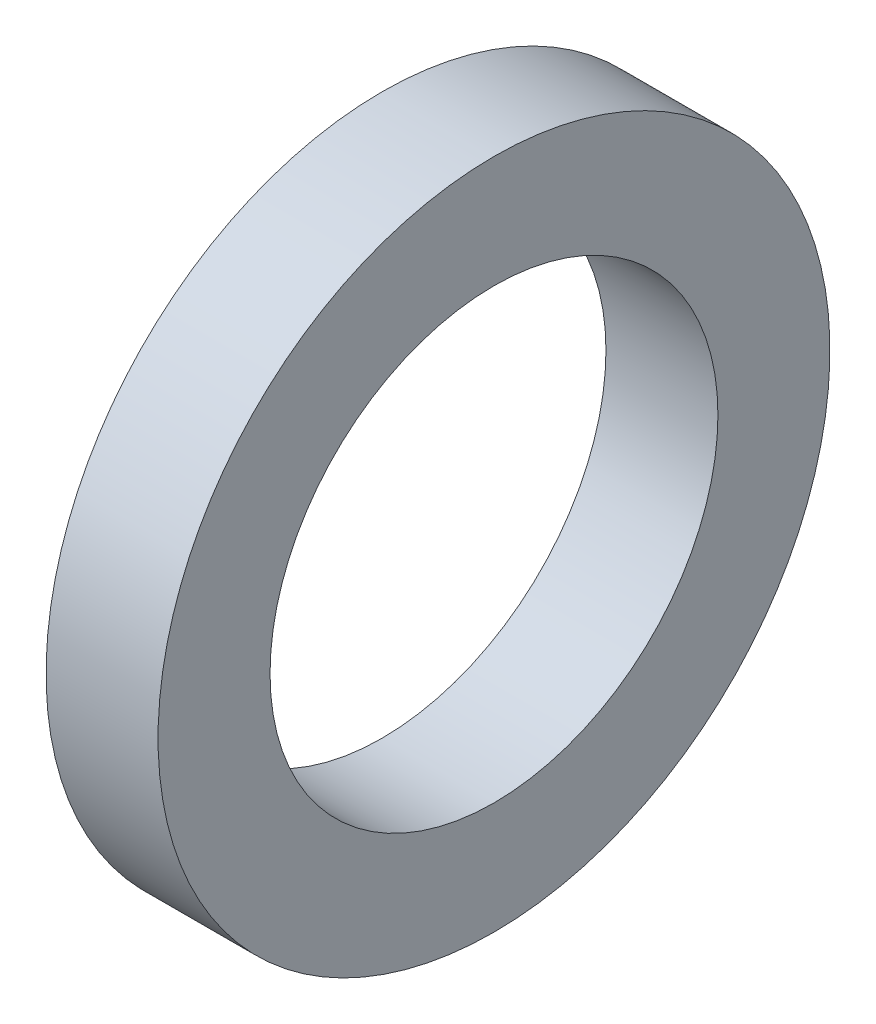
ISO-10303-21;
HEADER;
FILE_DESCRIPTION(('STEP AP214'),'2;1');
FILE_NAME('part.step','',(''),(''),'','','');
FILE_SCHEMA(('AUTOMOTIVE_DESIGN { 1 0 10303 214 1 1 1 1 }'));
ENDSEC;
DATA;
#1=APPLICATION_CONTEXT('core data for automotive mechanical design processes');
#2=APPLICATION_PROTOCOL_DEFINITION('international standard','automotive_design',2000,#1);
#3=PRODUCT_CONTEXT('',#1,'mechanical');
#4=PRODUCT('Part','Part','',(#3));
#5=PRODUCT_RELATED_PRODUCT_CATEGORY('part','',(#4));
#6=PRODUCT_DEFINITION_FORMATION('','',#4);
#7=PRODUCT_DEFINITION_CONTEXT('part definition',#1,'design');
#8=PRODUCT_DEFINITION('design','',#6,#7);
#9=PRODUCT_DEFINITION_SHAPE('','',#8);
#10=(LENGTH_UNIT() NAMED_UNIT(*) SI_UNIT(.MILLI.,.METRE.));
#11=(NAMED_UNIT(*) PLANE_ANGLE_UNIT() SI_UNIT($,.RADIAN.));
#12=(NAMED_UNIT(*) SI_UNIT($,.STERADIAN.) SOLID_ANGLE_UNIT());
#13=UNCERTAINTY_MEASURE_WITH_UNIT(LENGTH_MEASURE(1.E-05),#10,'distance_accuracy_value','');
#14=(GEOMETRIC_REPRESENTATION_CONTEXT(3) GLOBAL_UNCERTAINTY_ASSIGNED_CONTEXT((#13)) GLOBAL_UNIT_ASSIGNED_CONTEXT((#10,
#11,#12)) REPRESENTATION_CONTEXT('',''));
#15=CARTESIAN_POINT('',(0.,0.,0.));
#16=DIRECTION('',(0.,0.,1.));
#17=DIRECTION('',(1.,0.,0.));
#18=AXIS2_PLACEMENT_3D('',#15,#16,#17);
#19=CARTESIAN_POINT('',(2.,0.,0.));
#20=DIRECTION('',(-1.,0.,0.));
#21=DIRECTION('',(0.,-1.,0.));
#22=AXIS2_PLACEMENT_3D('',#19,#20,#21);
#23=PLANE('',#22);
#24=CARTESIAN_POINT('',(2.,0.,0.));
#25=DIRECTION('',(1.,0.,0.));
#26=DIRECTION('',(0.,1.,0.));
#27=AXIS2_PLACEMENT_3D('',#24,#25,#26);
#28=CIRCLE('',#27,6.);
#29=CARTESIAN_POINT('',(2.,6.,0.));
#30=VERTEX_POINT('',#29);
#31=EDGE_CURVE('E10',#30,#30,#28,.T.);
#32=ORIENTED_EDGE('',*,*,#31,.T.);
#33=EDGE_LOOP('',(#32));
#34=FACE_BOUND('',#33,.T.);
#35=CARTESIAN_POINT('',(2.,0.,0.));
#36=DIRECTION('',(1.,0.,0.));
#37=DIRECTION('',(0.,1.,0.));
#38=AXIS2_PLACEMENT_3D('',#35,#36,#37);
#39=CIRCLE('',#38,4.);
#40=CARTESIAN_POINT('',(2.,4.,0.));
#41=VERTEX_POINT('',#40);
#42=EDGE_CURVE('E40',#41,#41,#39,.T.);
#43=ORIENTED_EDGE('',*,*,#42,.F.);
#44=EDGE_LOOP('',(#43));
#45=FACE_BOUND('',#44,.T.);
#46=ADVANCED_FACE('F30',(#34,#45),#23,.F.);
#47=CARTESIAN_POINT('',(0.,-6.,0.));
#48=DIRECTION('',(1.,0.,0.));
#49=DIRECTION('',(0.,1.,0.));
#50=AXIS2_PLACEMENT_3D('',#47,#48,#49);
#51=PLANE('',#50);
#52=CARTESIAN_POINT('',(0.,0.,0.));
#53=DIRECTION('',(1.,0.,0.));
#54=DIRECTION('',(0.,1.,0.));
#55=AXIS2_PLACEMENT_3D('',#52,#53,#54);
#56=CIRCLE('',#55,6.);
#57=CARTESIAN_POINT('',(0.,6.,0.));
#58=VERTEX_POINT('',#57);
#59=EDGE_CURVE('E36',#58,#58,#56,.T.);
#60=ORIENTED_EDGE('',*,*,#59,.F.);
#61=EDGE_LOOP('',(#60));
#62=FACE_BOUND('',#61,.T.);
#63=CARTESIAN_POINT('',(0.,0.,0.));
#64=DIRECTION('',(1.,0.,0.));
#65=DIRECTION('',(0.,1.,0.));
#66=AXIS2_PLACEMENT_3D('',#63,#64,#65);
#67=CIRCLE('',#66,4.);
#68=CARTESIAN_POINT('',(0.,4.,0.));
#69=VERTEX_POINT('',#68);
#70=EDGE_CURVE('E44',#69,#69,#67,.T.);
#71=ORIENTED_EDGE('',*,*,#70,.T.);
#72=EDGE_LOOP('',(#71));
#73=FACE_BOUND('',#72,.T.);
#74=ADVANCED_FACE('F50',(#62,#73),#51,.F.);
#75=CARTESIAN_POINT('',(0.,0.,0.));
#76=DIRECTION('',(1.,0.,0.));
#77=DIRECTION('',(0.,1.,0.));
#78=AXIS2_PLACEMENT_3D('',#75,#76,#77);
#79=CYLINDRICAL_SURFACE('',#78,6.);
#80=ORIENTED_EDGE('',*,*,#31,.F.);
#81=EDGE_LOOP('',(#80));
#82=FACE_BOUND('',#81,.T.);
#83=ORIENTED_EDGE('',*,*,#59,.T.);
#84=EDGE_LOOP('',(#83));
#85=FACE_BOUND('',#84,.T.);
#86=ADVANCED_FACE('F54',(#82,#85),#79,.T.);
#87=CARTESIAN_POINT('',(0.,0.,0.));
#88=DIRECTION('',(1.,0.,0.));
#89=DIRECTION('',(0.,1.,0.));
#90=AXIS2_PLACEMENT_3D('',#87,#88,#89);
#91=CYLINDRICAL_SURFACE('',#90,4.);
#92=ORIENTED_EDGE('',*,*,#42,.T.);
#93=EDGE_LOOP('',(#92));
#94=FACE_BOUND('',#93,.T.);
#95=ORIENTED_EDGE('',*,*,#70,.F.);
#96=EDGE_LOOP('',(#95));
#97=FACE_BOUND('',#96,.T.);
#98=ADVANCED_FACE('F52',(#94,#97),#91,.F.);
#99=CLOSED_SHELL('',(#46,#74,#86,#98));
#100=MANIFOLD_SOLID_BREP('B2',#99);
#101=ADVANCED_BREP_SHAPE_REPRESENTATION('',(#18,#100),#14);
#102=SHAPE_DEFINITION_REPRESENTATION(#9,#101);
ENDSEC;
END-ISO-10303-21;
